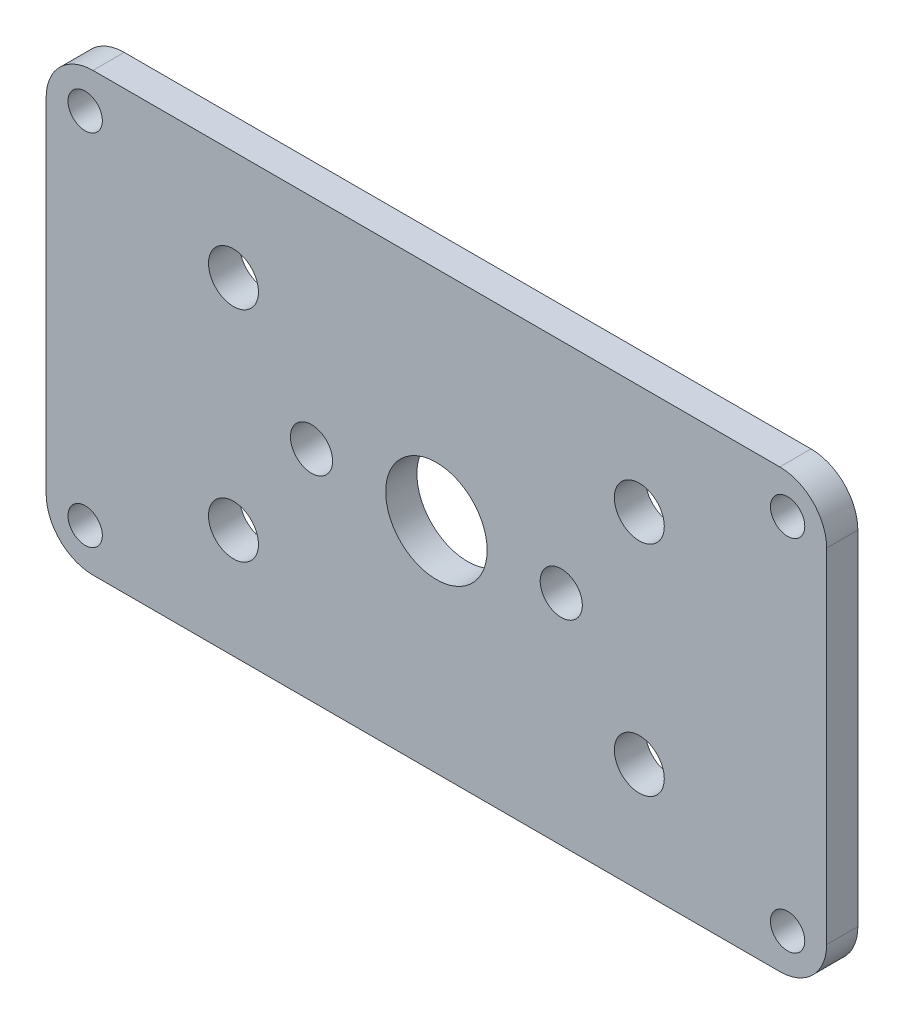
ISO-10303-21;
HEADER;
FILE_DESCRIPTION(('STEP AP214'),'2;1');
FILE_NAME('part.step','',(''),(''),'','','');
FILE_SCHEMA(('AUTOMOTIVE_DESIGN { 1 0 10303 214 1 1 1 1 }'));
ENDSEC;
DATA;
#1=APPLICATION_CONTEXT('core data for automotive mechanical design processes');
#2=APPLICATION_PROTOCOL_DEFINITION('international standard','automotive_design',2000,#1);
#3=PRODUCT_CONTEXT('',#1,'mechanical');
#4=PRODUCT('Part','Part','',(#3));
#5=PRODUCT_RELATED_PRODUCT_CATEGORY('part','',(#4));
#6=PRODUCT_DEFINITION_FORMATION('','',#4);
#7=PRODUCT_DEFINITION_CONTEXT('part definition',#1,'design');
#8=PRODUCT_DEFINITION('design','',#6,#7);
#9=PRODUCT_DEFINITION_SHAPE('','',#8);
#10=(LENGTH_UNIT() NAMED_UNIT(*) SI_UNIT(.MILLI.,.METRE.));
#11=(NAMED_UNIT(*) PLANE_ANGLE_UNIT() SI_UNIT($,.RADIAN.));
#12=(NAMED_UNIT(*) SI_UNIT($,.STERADIAN.) SOLID_ANGLE_UNIT());
#13=UNCERTAINTY_MEASURE_WITH_UNIT(LENGTH_MEASURE(1.E-05),#10,'distance_accuracy_value','');
#14=(GEOMETRIC_REPRESENTATION_CONTEXT(3) GLOBAL_UNCERTAINTY_ASSIGNED_CONTEXT((#13)) GLOBAL_UNIT_ASSIGNED_CONTEXT((#10,
#11,#12)) REPRESENTATION_CONTEXT('',''));
#15=CARTESIAN_POINT('',(0.,0.,0.));
#16=DIRECTION('',(0.,0.,1.));
#17=DIRECTION('',(1.,0.,0.));
#18=AXIS2_PLACEMENT_3D('',#15,#16,#17);
#19=CARTESIAN_POINT('',(-25.,-14.,-2.));
#20=DIRECTION('',(0.,1.,0.));
#21=DIRECTION('',(0.,0.,-1.));
#22=AXIS2_PLACEMENT_3D('',#19,#20,#21);
#23=PLANE('',#22);
#24=DIRECTION('',(1.,0.,0.));
#25=VECTOR('',#24,1.);
#26=CARTESIAN_POINT('',(-25.,-14.,-2.));
#27=LINE('',#26,#25);
#28=CARTESIAN_POINT('',(-22.,-14.,-2.));
#29=VERTEX_POINT('',#28);
#30=CARTESIAN_POINT('',(22.,-14.,-2.));
#31=VERTEX_POINT('',#30);
#32=EDGE_CURVE('E146',#29,#31,#27,.T.);
#33=ORIENTED_EDGE('',*,*,#32,.T.);
#34=DIRECTION('',(0.,0.,1.));
#35=VECTOR('',#34,1.);
#36=CARTESIAN_POINT('',(22.,-14.,-2.));
#37=LINE('',#36,#35);
#38=CARTESIAN_POINT('',(22.,-14.,0.));
#39=VERTEX_POINT('',#38);
#40=EDGE_CURVE('E127',#39,#31,#37,.F.);
#41=ORIENTED_EDGE('',*,*,#40,.F.);
#42=DIRECTION('',(1.,0.,0.));
#43=VECTOR('',#42,1.);
#44=CARTESIAN_POINT('',(-25.,-14.,0.));
#45=LINE('',#44,#43);
#46=CARTESIAN_POINT('',(-22.,-14.,0.));
#47=VERTEX_POINT('',#46);
#48=EDGE_CURVE('E109',#47,#39,#45,.T.);
#49=ORIENTED_EDGE('',*,*,#48,.F.);
#50=DIRECTION('',(0.,0.,1.));
#51=VECTOR('',#50,1.);
#52=CARTESIAN_POINT('',(-22.,-14.,0.));
#53=LINE('',#52,#51);
#54=EDGE_CURVE('E120',#29,#47,#53,.T.);
#55=ORIENTED_EDGE('',*,*,#54,.F.);
#56=EDGE_LOOP('',(#33,#41,#49,#55));
#57=FACE_BOUND('',#56,.T.);
#58=ADVANCED_FACE('F37',(#57),#23,.F.);
#59=CARTESIAN_POINT('',(25.,-14.,-2.));
#60=DIRECTION('',(-1.,0.,0.));
#61=DIRECTION('',(0.,0.,-1.));
#62=AXIS2_PLACEMENT_3D('',#59,#60,#61);
#63=PLANE('',#62);
#64=DIRECTION('',(0.,1.,0.));
#65=VECTOR('',#64,1.);
#66=CARTESIAN_POINT('',(25.,-14.,-2.));
#67=LINE('',#66,#65);
#68=CARTESIAN_POINT('',(25.,-11.,-2.));
#69=VERTEX_POINT('',#68);
#70=CARTESIAN_POINT('',(25.,11.,-2.));
#71=VERTEX_POINT('',#70);
#72=EDGE_CURVE('E227',#69,#71,#67,.T.);
#73=ORIENTED_EDGE('',*,*,#72,.T.);
#74=DIRECTION('',(0.,0.,1.));
#75=VECTOR('',#74,1.);
#76=CARTESIAN_POINT('',(25.,11.,-2.));
#77=LINE('',#76,#75);
#78=CARTESIAN_POINT('',(25.,11.,0.));
#79=VERTEX_POINT('',#78);
#80=EDGE_CURVE('E46',#79,#71,#77,.F.);
#81=ORIENTED_EDGE('',*,*,#80,.F.);
#82=DIRECTION('',(0.,1.,0.));
#83=VECTOR('',#82,1.);
#84=CARTESIAN_POINT('',(25.,-14.,0.));
#85=LINE('',#84,#83);
#86=CARTESIAN_POINT('',(25.,-11.,0.));
#87=VERTEX_POINT('',#86);
#88=EDGE_CURVE('E130',#87,#79,#85,.T.);
#89=ORIENTED_EDGE('',*,*,#88,.F.);
#90=DIRECTION('',(0.,0.,1.));
#91=VECTOR('',#90,1.);
#92=CARTESIAN_POINT('',(25.,-11.,-2.));
#93=LINE('',#92,#91);
#94=EDGE_CURVE('E11',#69,#87,#93,.T.);
#95=ORIENTED_EDGE('',*,*,#94,.F.);
#96=EDGE_LOOP('',(#73,#81,#89,#95));
#97=FACE_BOUND('',#96,.T.);
#98=ADVANCED_FACE('F247',(#97),#63,.F.);
#99=CARTESIAN_POINT('',(-25.,14.,-2.));
#100=DIRECTION('',(0.,1.,0.));
#101=DIRECTION('',(0.,0.,-1.));
#102=AXIS2_PLACEMENT_3D('',#99,#100,#101);
#103=PLANE('',#102);
#104=DIRECTION('',(1.,0.,0.));
#105=VECTOR('',#104,1.);
#106=CARTESIAN_POINT('',(-25.,14.,0.));
#107=LINE('',#106,#105);
#108=CARTESIAN_POINT('',(-22.,14.,0.));
#109=VERTEX_POINT('',#108);
#110=CARTESIAN_POINT('',(22.,14.,0.));
#111=VERTEX_POINT('',#110);
#112=EDGE_CURVE('E134',#109,#111,#107,.T.);
#113=ORIENTED_EDGE('',*,*,#112,.T.);
#114=DIRECTION('',(0.,0.,1.));
#115=VECTOR('',#114,1.);
#116=CARTESIAN_POINT('',(22.,14.,0.));
#117=LINE('',#116,#115);
#118=CARTESIAN_POINT('',(22.,14.,-2.));
#119=VERTEX_POINT('',#118);
#120=EDGE_CURVE('E161',#119,#111,#117,.T.);
#121=ORIENTED_EDGE('',*,*,#120,.F.);
#122=DIRECTION('',(1.,0.,0.));
#123=VECTOR('',#122,1.);
#124=CARTESIAN_POINT('',(-25.,14.,-2.));
#125=LINE('',#124,#123);
#126=CARTESIAN_POINT('',(-22.,14.,-2.));
#127=VERTEX_POINT('',#126);
#128=EDGE_CURVE('E229',#127,#119,#125,.T.);
#129=ORIENTED_EDGE('',*,*,#128,.F.);
#130=DIRECTION('',(0.,0.,1.));
#131=VECTOR('',#130,1.);
#132=CARTESIAN_POINT('',(-22.,14.,-2.));
#133=LINE('',#132,#131);
#134=EDGE_CURVE('E163',#109,#127,#133,.F.);
#135=ORIENTED_EDGE('',*,*,#134,.F.);
#136=EDGE_LOOP('',(#113,#121,#129,#135));
#137=FACE_BOUND('',#136,.T.);
#138=ADVANCED_FACE('F242',(#137),#103,.T.);
#139=CARTESIAN_POINT('',(-25.,-14.,-2.));
#140=DIRECTION('',(-1.,0.,0.));
#141=DIRECTION('',(0.,0.,-1.));
#142=AXIS2_PLACEMENT_3D('',#139,#140,#141);
#143=PLANE('',#142);
#144=DIRECTION('',(0.,1.,0.));
#145=VECTOR('',#144,1.);
#146=CARTESIAN_POINT('',(-25.,-14.,0.));
#147=LINE('',#146,#145);
#148=CARTESIAN_POINT('',(-25.,-11.,0.));
#149=VERTEX_POINT('',#148);
#150=CARTESIAN_POINT('',(-25.,11.,0.));
#151=VERTEX_POINT('',#150);
#152=EDGE_CURVE('E112',#149,#151,#147,.T.);
#153=ORIENTED_EDGE('',*,*,#152,.T.);
#154=DIRECTION('',(0.,0.,1.));
#155=VECTOR('',#154,1.);
#156=CARTESIAN_POINT('',(-25.,11.,-2.));
#157=LINE('',#156,#155);
#158=CARTESIAN_POINT('',(-25.,11.,-2.));
#159=VERTEX_POINT('',#158);
#160=EDGE_CURVE('E116',#159,#151,#157,.T.);
#161=ORIENTED_EDGE('',*,*,#160,.F.);
#162=DIRECTION('',(0.,1.,0.));
#163=VECTOR('',#162,1.);
#164=CARTESIAN_POINT('',(-25.,-14.,-2.));
#165=LINE('',#164,#163);
#166=CARTESIAN_POINT('',(-25.,-11.,-2.));
#167=VERTEX_POINT('',#166);
#168=EDGE_CURVE('E140',#167,#159,#165,.T.);
#169=ORIENTED_EDGE('',*,*,#168,.F.);
#170=DIRECTION('',(0.,0.,1.));
#171=VECTOR('',#170,1.);
#172=CARTESIAN_POINT('',(-25.,-11.,-2.));
#173=LINE('',#172,#171);
#174=EDGE_CURVE('E154',#149,#167,#173,.F.);
#175=ORIENTED_EDGE('',*,*,#174,.F.);
#176=EDGE_LOOP('',(#153,#161,#169,#175));
#177=FACE_BOUND('',#176,.T.);
#178=ADVANCED_FACE('F236',(#177),#143,.T.);
#179=CARTESIAN_POINT('',(0.,0.,-2.));
#180=DIRECTION('',(0.,0.,-1.));
#181=DIRECTION('',(1.,0.,0.));
#182=AXIS2_PLACEMENT_3D('',#179,#180,#181);
#183=PLANE('',#182);
#184=CARTESIAN_POINT('',(-13.,-7.,-2.));
#185=DIRECTION('',(0.,0.,1.));
#186=DIRECTION('',(-1.,0.,0.));
#187=AXIS2_PLACEMENT_3D('',#184,#185,#186);
#188=CIRCLE('',#187,1.6);
#189=CARTESIAN_POINT('',(-14.6,-7.,-2.));
#190=VERTEX_POINT('',#189);
#191=EDGE_CURVE('E194',#190,#190,#188,.T.);
#192=ORIENTED_EDGE('',*,*,#191,.T.);
#193=EDGE_LOOP('',(#192));
#194=FACE_BOUND('',#193,.T.);
#195=CARTESIAN_POINT('',(13.,7.,-2.));
#196=DIRECTION('',(0.,0.,1.));
#197=DIRECTION('',(1.,0.,0.));
#198=AXIS2_PLACEMENT_3D('',#195,#196,#197);
#199=CIRCLE('',#198,1.6);
#200=CARTESIAN_POINT('',(14.6,7.,-2.));
#201=VERTEX_POINT('',#200);
#202=EDGE_CURVE('E432',#201,#201,#199,.T.);
#203=ORIENTED_EDGE('',*,*,#202,.T.);
#204=EDGE_LOOP('',(#203));
#205=FACE_BOUND('',#204,.T.);
#206=CARTESIAN_POINT('',(13.,-7.,-2.));
#207=DIRECTION('',(0.,0.,1.));
#208=DIRECTION('',(-1.,0.,0.));
#209=AXIS2_PLACEMENT_3D('',#206,#207,#208);
#210=CIRCLE('',#209,1.6);
#211=CARTESIAN_POINT('',(11.4,-7.,-2.));
#212=VERTEX_POINT('',#211);
#213=EDGE_CURVE('E207',#212,#212,#210,.T.);
#214=ORIENTED_EDGE('',*,*,#213,.T.);
#215=EDGE_LOOP('',(#214));
#216=FACE_BOUND('',#215,.T.);
#217=CARTESIAN_POINT('',(-13.,7.,-2.));
#218=DIRECTION('',(0.,0.,1.));
#219=DIRECTION('',(1.,0.,0.));
#220=AXIS2_PLACEMENT_3D('',#217,#218,#219);
#221=CIRCLE('',#220,1.6);
#222=CARTESIAN_POINT('',(-11.4,7.,-2.));
#223=VERTEX_POINT('',#222);
#224=EDGE_CURVE('E190',#223,#223,#221,.T.);
#225=ORIENTED_EDGE('',*,*,#224,.T.);
#226=EDGE_LOOP('',(#225));
#227=FACE_BOUND('',#226,.T.);
#228=CARTESIAN_POINT('',(0.,0.,-2.));
#229=DIRECTION('',(0.,0.,1.));
#230=DIRECTION('',(1.,0.,0.));
#231=AXIS2_PLACEMENT_3D('',#228,#229,#230);
#232=CIRCLE('',#231,3.25);
#233=CARTESIAN_POINT('',(3.25,0.,-2.));
#234=VERTEX_POINT('',#233);
#235=EDGE_CURVE('E186',#234,#234,#232,.T.);
#236=ORIENTED_EDGE('',*,*,#235,.T.);
#237=EDGE_LOOP('',(#236));
#238=FACE_BOUND('',#237,.T.);
#239=CARTESIAN_POINT('',(-22.5,-11.5,-2.));
#240=DIRECTION('',(0.,0.,1.));
#241=DIRECTION('',(1.,0.,0.));
#242=AXIS2_PLACEMENT_3D('',#239,#240,#241);
#243=CIRCLE('',#242,1.1);
#244=CARTESIAN_POINT('',(-21.4,-11.5,-2.));
#245=VERTEX_POINT('',#244);
#246=EDGE_CURVE('E170',#245,#245,#243,.T.);
#247=ORIENTED_EDGE('',*,*,#246,.T.);
#248=EDGE_LOOP('',(#247));
#249=FACE_BOUND('',#248,.T.);
#250=CARTESIAN_POINT('',(22.5000000000001,-11.5,-2.));
#251=DIRECTION('',(0.,0.,1.));
#252=DIRECTION('',(1.,0.,0.));
#253=AXIS2_PLACEMENT_3D('',#250,#251,#252);
#254=CIRCLE('',#253,1.1);
#255=CARTESIAN_POINT('',(23.6000000000001,-11.5,-2.));
#256=VERTEX_POINT('',#255);
#257=EDGE_CURVE('E213',#256,#256,#254,.T.);
#258=ORIENTED_EDGE('',*,*,#257,.T.);
#259=EDGE_LOOP('',(#258));
#260=FACE_BOUND('',#259,.T.);
#261=CARTESIAN_POINT('',(22.5,11.5,-2.));
#262=DIRECTION('',(0.,0.,1.));
#263=DIRECTION('',(1.,0.,0.));
#264=AXIS2_PLACEMENT_3D('',#261,#262,#263);
#265=CIRCLE('',#264,1.1);
#266=CARTESIAN_POINT('',(23.6,11.5,-2.));
#267=VERTEX_POINT('',#266);
#268=EDGE_CURVE('E216',#267,#267,#265,.T.);
#269=ORIENTED_EDGE('',*,*,#268,.T.);
#270=EDGE_LOOP('',(#269));
#271=FACE_BOUND('',#270,.T.);
#272=CARTESIAN_POINT('',(-8.00000000000001,0.,-2.));
#273=DIRECTION('',(0.,0.,1.));
#274=DIRECTION('',(1.,0.,0.));
#275=AXIS2_PLACEMENT_3D('',#272,#273,#274);
#276=CIRCLE('',#275,1.35);
#277=CARTESIAN_POINT('',(-6.65000000000001,0.,-2.));
#278=VERTEX_POINT('',#277);
#279=EDGE_CURVE('E219',#278,#278,#276,.T.);
#280=ORIENTED_EDGE('',*,*,#279,.T.);
#281=EDGE_LOOP('',(#280));
#282=FACE_BOUND('',#281,.T.);
#283=CARTESIAN_POINT('',(8.,0.,-2.));
#284=DIRECTION('',(0.,0.,1.));
#285=DIRECTION('',(1.,0.,0.));
#286=AXIS2_PLACEMENT_3D('',#283,#284,#285);
#287=CIRCLE('',#286,1.35);
#288=CARTESIAN_POINT('',(9.35,0.,-2.));
#289=VERTEX_POINT('',#288);
#290=EDGE_CURVE('E185',#289,#289,#287,.T.);
#291=ORIENTED_EDGE('',*,*,#290,.T.);
#292=EDGE_LOOP('',(#291));
#293=FACE_BOUND('',#292,.T.);
#294=CARTESIAN_POINT('',(-22.5,11.5,-2.));
#295=DIRECTION('',(0.,0.,1.));
#296=DIRECTION('',(1.,0.,0.));
#297=AXIS2_PLACEMENT_3D('',#294,#295,#296);
#298=CIRCLE('',#297,1.1);
#299=CARTESIAN_POINT('',(-21.4,11.5,-2.));
#300=VERTEX_POINT('',#299);
#301=EDGE_CURVE('E137',#300,#300,#298,.T.);
#302=ORIENTED_EDGE('',*,*,#301,.T.);
#303=EDGE_LOOP('',(#302));
#304=FACE_BOUND('',#303,.T.);
#305=ORIENTED_EDGE('',*,*,#168,.T.);
#306=CARTESIAN_POINT('',(-22.,11.,-2.));
#307=DIRECTION('',(0.,0.,1.));
#308=DIRECTION('',(1.,0.,0.));
#309=AXIS2_PLACEMENT_3D('',#306,#307,#308);
#310=CIRCLE('',#309,3.);
#311=EDGE_CURVE('E61',#127,#159,#310,.T.);
#312=ORIENTED_EDGE('',*,*,#311,.F.);
#313=ORIENTED_EDGE('',*,*,#128,.T.);
#314=CARTESIAN_POINT('',(22.,11.,-2.));
#315=DIRECTION('',(0.,0.,1.));
#316=DIRECTION('',(1.,0.,0.));
#317=AXIS2_PLACEMENT_3D('',#314,#315,#316);
#318=CIRCLE('',#317,3.);
#319=EDGE_CURVE('E54',#71,#119,#318,.T.);
#320=ORIENTED_EDGE('',*,*,#319,.F.);
#321=ORIENTED_EDGE('',*,*,#72,.F.);
#322=CARTESIAN_POINT('',(22.,-11.,-2.));
#323=DIRECTION('',(0.,0.,1.));
#324=DIRECTION('',(1.,0.,0.));
#325=AXIS2_PLACEMENT_3D('',#322,#323,#324);
#326=CIRCLE('',#325,3.);
#327=EDGE_CURVE('E157',#31,#69,#326,.T.);
#328=ORIENTED_EDGE('',*,*,#327,.F.);
#329=ORIENTED_EDGE('',*,*,#32,.F.);
#330=CARTESIAN_POINT('',(-22.,-11.,-2.));
#331=DIRECTION('',(0.,0.,1.));
#332=DIRECTION('',(1.,0.,0.));
#333=AXIS2_PLACEMENT_3D('',#330,#331,#332);
#334=CIRCLE('',#333,3.);
#335=EDGE_CURVE('E122',#167,#29,#334,.T.);
#336=ORIENTED_EDGE('',*,*,#335,.F.);
#337=EDGE_LOOP('',(#305,#312,#313,#320,#321,#328,#329,#336));
#338=FACE_BOUND('',#337,.T.);
#339=ADVANCED_FACE('F234',(#194,#205,#216,#227,#238,#249,#260,#271,#282,#293,#304,#338),#183,.T.);
#340=CARTESIAN_POINT('',(0.,0.,0.));
#341=DIRECTION('',(0.,0.,-1.));
#342=DIRECTION('',(1.,0.,0.));
#343=AXIS2_PLACEMENT_3D('',#340,#341,#342);
#344=PLANE('',#343);
#345=CARTESIAN_POINT('',(-13.,-7.,0.));
#346=DIRECTION('',(0.,0.,1.));
#347=DIRECTION('',(1.,0.,0.));
#348=AXIS2_PLACEMENT_3D('',#345,#346,#347);
#349=CIRCLE('',#348,1.6);
#350=CARTESIAN_POINT('',(-11.4,-7.,0.));
#351=VERTEX_POINT('',#350);
#352=EDGE_CURVE('E41',#351,#351,#349,.T.);
#353=ORIENTED_EDGE('',*,*,#352,.F.);
#354=EDGE_LOOP('',(#353));
#355=FACE_BOUND('',#354,.T.);
#356=CARTESIAN_POINT('',(13.,7.,0.));
#357=DIRECTION('',(0.,0.,1.));
#358=DIRECTION('',(1.,0.,0.));
#359=AXIS2_PLACEMENT_3D('',#356,#357,#358);
#360=CIRCLE('',#359,1.6);
#361=CARTESIAN_POINT('',(14.6,7.,0.));
#362=VERTEX_POINT('',#361);
#363=EDGE_CURVE('E193',#362,#362,#360,.T.);
#364=ORIENTED_EDGE('',*,*,#363,.F.);
#365=EDGE_LOOP('',(#364));
#366=FACE_BOUND('',#365,.T.);
#367=CARTESIAN_POINT('',(13.,-7.,0.));
#368=DIRECTION('',(0.,0.,1.));
#369=DIRECTION('',(1.,0.,0.));
#370=AXIS2_PLACEMENT_3D('',#367,#368,#369);
#371=CIRCLE('',#370,1.6);
#372=CARTESIAN_POINT('',(14.6,-7.,0.));
#373=VERTEX_POINT('',#372);
#374=EDGE_CURVE('E191',#373,#373,#371,.T.);
#375=ORIENTED_EDGE('',*,*,#374,.F.);
#376=EDGE_LOOP('',(#375));
#377=FACE_BOUND('',#376,.T.);
#378=CARTESIAN_POINT('',(-13.,7.,0.));
#379=DIRECTION('',(0.,0.,1.));
#380=DIRECTION('',(1.,0.,0.));
#381=AXIS2_PLACEMENT_3D('',#378,#379,#380);
#382=CIRCLE('',#381,1.6);
#383=CARTESIAN_POINT('',(-11.4,7.,0.));
#384=VERTEX_POINT('',#383);
#385=EDGE_CURVE('E187',#384,#384,#382,.T.);
#386=ORIENTED_EDGE('',*,*,#385,.F.);
#387=EDGE_LOOP('',(#386));
#388=FACE_BOUND('',#387,.T.);
#389=CARTESIAN_POINT('',(0.,0.,0.));
#390=DIRECTION('',(0.,0.,1.));
#391=DIRECTION('',(1.,0.,0.));
#392=AXIS2_PLACEMENT_3D('',#389,#390,#391);
#393=CIRCLE('',#392,3.25);
#394=CARTESIAN_POINT('',(3.25,0.,0.));
#395=VERTEX_POINT('',#394);
#396=EDGE_CURVE('E182',#395,#395,#393,.T.);
#397=ORIENTED_EDGE('',*,*,#396,.F.);
#398=EDGE_LOOP('',(#397));
#399=FACE_BOUND('',#398,.T.);
#400=CARTESIAN_POINT('',(-22.5,-11.5,0.));
#401=DIRECTION('',(0.,0.,1.));
#402=DIRECTION('',(1.,0.,0.));
#403=AXIS2_PLACEMENT_3D('',#400,#401,#402);
#404=CIRCLE('',#403,1.1);
#405=CARTESIAN_POINT('',(-21.4,-11.5,0.));
#406=VERTEX_POINT('',#405);
#407=EDGE_CURVE('E179',#406,#406,#404,.T.);
#408=ORIENTED_EDGE('',*,*,#407,.F.);
#409=EDGE_LOOP('',(#408));
#410=FACE_BOUND('',#409,.T.);
#411=CARTESIAN_POINT('',(22.5000000000001,-11.5,0.));
#412=DIRECTION('',(0.,0.,1.));
#413=DIRECTION('',(1.,0.,0.));
#414=AXIS2_PLACEMENT_3D('',#411,#412,#413);
#415=CIRCLE('',#414,1.1);
#416=CARTESIAN_POINT('',(23.6000000000001,-11.5,0.));
#417=VERTEX_POINT('',#416);
#418=EDGE_CURVE('E176',#417,#417,#415,.T.);
#419=ORIENTED_EDGE('',*,*,#418,.F.);
#420=EDGE_LOOP('',(#419));
#421=FACE_BOUND('',#420,.T.);
#422=CARTESIAN_POINT('',(22.5,11.5,0.));
#423=DIRECTION('',(0.,0.,1.));
#424=DIRECTION('',(1.,0.,0.));
#425=AXIS2_PLACEMENT_3D('',#422,#423,#424);
#426=CIRCLE('',#425,1.1);
#427=CARTESIAN_POINT('',(23.6,11.5,0.));
#428=VERTEX_POINT('',#427);
#429=EDGE_CURVE('E173',#428,#428,#426,.T.);
#430=ORIENTED_EDGE('',*,*,#429,.F.);
#431=EDGE_LOOP('',(#430));
#432=FACE_BOUND('',#431,.T.);
#433=CARTESIAN_POINT('',(-8.00000000000001,0.,0.));
#434=DIRECTION('',(0.,0.,1.));
#435=DIRECTION('',(1.,0.,0.));
#436=AXIS2_PLACEMENT_3D('',#433,#434,#435);
#437=CIRCLE('',#436,1.35);
#438=CARTESIAN_POINT('',(-6.65000000000001,0.,0.));
#439=VERTEX_POINT('',#438);
#440=EDGE_CURVE('E169',#439,#439,#437,.T.);
#441=ORIENTED_EDGE('',*,*,#440,.F.);
#442=EDGE_LOOP('',(#441));
#443=FACE_BOUND('',#442,.T.);
#444=CARTESIAN_POINT('',(8.,0.,0.));
#445=DIRECTION('',(0.,0.,1.));
#446=DIRECTION('',(1.,0.,0.));
#447=AXIS2_PLACEMENT_3D('',#444,#445,#446);
#448=CIRCLE('',#447,1.35);
#449=CARTESIAN_POINT('',(9.35,0.,0.));
#450=VERTEX_POINT('',#449);
#451=EDGE_CURVE('E166',#450,#450,#448,.T.);
#452=ORIENTED_EDGE('',*,*,#451,.F.);
#453=EDGE_LOOP('',(#452));
#454=FACE_BOUND('',#453,.T.);
#455=CARTESIAN_POINT('',(-22.5,11.5,0.));
#456=DIRECTION('',(0.,0.,1.));
#457=DIRECTION('',(1.,0.,0.));
#458=AXIS2_PLACEMENT_3D('',#455,#456,#457);
#459=CIRCLE('',#458,1.1);
#460=CARTESIAN_POINT('',(-21.4,11.5,0.));
#461=VERTEX_POINT('',#460);
#462=EDGE_CURVE('E131',#461,#461,#459,.T.);
#463=ORIENTED_EDGE('',*,*,#462,.F.);
#464=EDGE_LOOP('',(#463));
#465=FACE_BOUND('',#464,.T.);
#466=ORIENTED_EDGE('',*,*,#48,.T.);
#467=CARTESIAN_POINT('',(22.,-11.,0.));
#468=DIRECTION('',(0.,0.,1.));
#469=DIRECTION('',(1.,0.,0.));
#470=AXIS2_PLACEMENT_3D('',#467,#468,#469);
#471=CIRCLE('',#470,3.);
#472=EDGE_CURVE('E149',#87,#39,#471,.F.);
#473=ORIENTED_EDGE('',*,*,#472,.F.);
#474=ORIENTED_EDGE('',*,*,#88,.T.);
#475=CARTESIAN_POINT('',(22.,11.,0.));
#476=DIRECTION('',(0.,0.,1.));
#477=DIRECTION('',(1.,0.,0.));
#478=AXIS2_PLACEMENT_3D('',#475,#476,#477);
#479=CIRCLE('',#478,3.);
#480=EDGE_CURVE('E126',#111,#79,#479,.F.);
#481=ORIENTED_EDGE('',*,*,#480,.F.);
#482=ORIENTED_EDGE('',*,*,#112,.F.);
#483=CARTESIAN_POINT('',(-22.,11.,0.));
#484=DIRECTION('',(0.,0.,1.));
#485=DIRECTION('',(1.,0.,0.));
#486=AXIS2_PLACEMENT_3D('',#483,#484,#485);
#487=CIRCLE('',#486,3.);
#488=EDGE_CURVE('E117',#151,#109,#487,.F.);
#489=ORIENTED_EDGE('',*,*,#488,.F.);
#490=ORIENTED_EDGE('',*,*,#152,.F.);
#491=CARTESIAN_POINT('',(-22.,-11.,0.));
#492=DIRECTION('',(0.,0.,1.));
#493=DIRECTION('',(1.,0.,0.));
#494=AXIS2_PLACEMENT_3D('',#491,#492,#493);
#495=CIRCLE('',#494,3.);
#496=EDGE_CURVE('E105',#47,#149,#495,.F.);
#497=ORIENTED_EDGE('',*,*,#496,.F.);
#498=EDGE_LOOP('',(#466,#473,#474,#481,#482,#489,#490,#497));
#499=FACE_BOUND('',#498,.T.);
#500=ADVANCED_FACE('F107',(#355,#366,#377,#388,#399,#410,#421,#432,#443,#454,#465,#499),#344,.F.);
#501=CARTESIAN_POINT('',(-22.,-11.,-2.));
#502=DIRECTION('',(0.,0.,-1.));
#503=DIRECTION('',(1.,0.,0.));
#504=AXIS2_PLACEMENT_3D('',#501,#502,#503);
#505=CYLINDRICAL_SURFACE('',#504,3.);
#506=ORIENTED_EDGE('',*,*,#335,.T.);
#507=ORIENTED_EDGE('',*,*,#54,.T.);
#508=ORIENTED_EDGE('',*,*,#496,.T.);
#509=ORIENTED_EDGE('',*,*,#174,.T.);
#510=EDGE_LOOP('',(#506,#507,#508,#509));
#511=FACE_BOUND('',#510,.T.);
#512=ADVANCED_FACE('F121',(#511),#505,.T.);
#513=CARTESIAN_POINT('',(-22.,11.,-2.));
#514=DIRECTION('',(0.,0.,1.));
#515=DIRECTION('',(-1.,0.,0.));
#516=AXIS2_PLACEMENT_3D('',#513,#514,#515);
#517=CYLINDRICAL_SURFACE('',#516,3.);
#518=ORIENTED_EDGE('',*,*,#311,.T.);
#519=ORIENTED_EDGE('',*,*,#160,.T.);
#520=ORIENTED_EDGE('',*,*,#488,.T.);
#521=ORIENTED_EDGE('',*,*,#134,.T.);
#522=EDGE_LOOP('',(#518,#519,#520,#521));
#523=FACE_BOUND('',#522,.T.);
#524=ADVANCED_FACE('F238',(#523),#517,.T.);
#525=CARTESIAN_POINT('',(22.,-11.,-2.));
#526=DIRECTION('',(0.,0.,1.));
#527=DIRECTION('',(-1.,0.,0.));
#528=AXIS2_PLACEMENT_3D('',#525,#526,#527);
#529=CYLINDRICAL_SURFACE('',#528,3.);
#530=ORIENTED_EDGE('',*,*,#327,.T.);
#531=ORIENTED_EDGE('',*,*,#94,.T.);
#532=ORIENTED_EDGE('',*,*,#472,.T.);
#533=ORIENTED_EDGE('',*,*,#40,.T.);
#534=EDGE_LOOP('',(#530,#531,#532,#533));
#535=FACE_BOUND('',#534,.T.);
#536=ADVANCED_FACE('F250',(#535),#529,.T.);
#537=CARTESIAN_POINT('',(22.,11.,-2.));
#538=DIRECTION('',(0.,0.,-1.));
#539=DIRECTION('',(1.,0.,0.));
#540=AXIS2_PLACEMENT_3D('',#537,#538,#539);
#541=CYLINDRICAL_SURFACE('',#540,3.);
#542=ORIENTED_EDGE('',*,*,#319,.T.);
#543=ORIENTED_EDGE('',*,*,#120,.T.);
#544=ORIENTED_EDGE('',*,*,#480,.T.);
#545=ORIENTED_EDGE('',*,*,#80,.T.);
#546=EDGE_LOOP('',(#542,#543,#544,#545));
#547=FACE_BOUND('',#546,.T.);
#548=ADVANCED_FACE('F39',(#547),#541,.T.);
#549=CARTESIAN_POINT('',(-22.5,11.5,8.));
#550=DIRECTION('',(0.,0.,-1.));
#551=DIRECTION('',(1.,0.,0.));
#552=AXIS2_PLACEMENT_3D('',#549,#550,#551);
#553=CYLINDRICAL_SURFACE('',#552,1.1);
#554=ORIENTED_EDGE('',*,*,#301,.F.);
#555=EDGE_LOOP('',(#554));
#556=FACE_BOUND('',#555,.T.);
#557=ORIENTED_EDGE('',*,*,#462,.T.);
#558=EDGE_LOOP('',(#557));
#559=FACE_BOUND('',#558,.T.);
#560=ADVANCED_FACE('F256',(#556,#559),#553,.F.);
#561=CARTESIAN_POINT('',(8.,0.,8.));
#562=DIRECTION('',(0.,0.,-1.));
#563=DIRECTION('',(1.,0.,0.));
#564=AXIS2_PLACEMENT_3D('',#561,#562,#563);
#565=CYLINDRICAL_SURFACE('',#564,1.35);
#566=ORIENTED_EDGE('',*,*,#290,.F.);
#567=EDGE_LOOP('',(#566));
#568=FACE_BOUND('',#567,.T.);
#569=ORIENTED_EDGE('',*,*,#451,.T.);
#570=EDGE_LOOP('',(#569));
#571=FACE_BOUND('',#570,.T.);
#572=ADVANCED_FACE('F327',(#568,#571),#565,.F.);
#573=CARTESIAN_POINT('',(-8.00000000000001,0.,8.));
#574=DIRECTION('',(0.,0.,-1.));
#575=DIRECTION('',(1.,0.,0.));
#576=AXIS2_PLACEMENT_3D('',#573,#574,#575);
#577=CYLINDRICAL_SURFACE('',#576,1.35);
#578=ORIENTED_EDGE('',*,*,#279,.F.);
#579=EDGE_LOOP('',(#578));
#580=FACE_BOUND('',#579,.T.);
#581=ORIENTED_EDGE('',*,*,#440,.T.);
#582=EDGE_LOOP('',(#581));
#583=FACE_BOUND('',#582,.T.);
#584=ADVANCED_FACE('F336',(#580,#583),#577,.F.);
#585=CARTESIAN_POINT('',(22.5,11.5,8.));
#586=DIRECTION('',(0.,0.,-1.));
#587=DIRECTION('',(1.,0.,0.));
#588=AXIS2_PLACEMENT_3D('',#585,#586,#587);
#589=CYLINDRICAL_SURFACE('',#588,1.1);
#590=ORIENTED_EDGE('',*,*,#268,.F.);
#591=EDGE_LOOP('',(#590));
#592=FACE_BOUND('',#591,.T.);
#593=ORIENTED_EDGE('',*,*,#429,.T.);
#594=EDGE_LOOP('',(#593));
#595=FACE_BOUND('',#594,.T.);
#596=ADVANCED_FACE('F346',(#592,#595),#589,.F.);
#597=CARTESIAN_POINT('',(22.5000000000001,-11.5,8.));
#598=DIRECTION('',(0.,0.,-1.));
#599=DIRECTION('',(1.,0.,0.));
#600=AXIS2_PLACEMENT_3D('',#597,#598,#599);
#601=CYLINDRICAL_SURFACE('',#600,1.1);
#602=ORIENTED_EDGE('',*,*,#257,.F.);
#603=EDGE_LOOP('',(#602));
#604=FACE_BOUND('',#603,.T.);
#605=ORIENTED_EDGE('',*,*,#418,.T.);
#606=EDGE_LOOP('',(#605));
#607=FACE_BOUND('',#606,.T.);
#608=ADVANCED_FACE('F356',(#604,#607),#601,.F.);
#609=CARTESIAN_POINT('',(-22.5,-11.5,8.));
#610=DIRECTION('',(0.,0.,-1.));
#611=DIRECTION('',(1.,0.,0.));
#612=AXIS2_PLACEMENT_3D('',#609,#610,#611);
#613=CYLINDRICAL_SURFACE('',#612,1.1);
#614=ORIENTED_EDGE('',*,*,#246,.F.);
#615=EDGE_LOOP('',(#614));
#616=FACE_BOUND('',#615,.T.);
#617=ORIENTED_EDGE('',*,*,#407,.T.);
#618=EDGE_LOOP('',(#617));
#619=FACE_BOUND('',#618,.T.);
#620=ADVANCED_FACE('F366',(#616,#619),#613,.F.);
#621=CARTESIAN_POINT('',(0.,0.,8.));
#622=DIRECTION('',(0.,0.,-1.));
#623=DIRECTION('',(1.,0.,0.));
#624=AXIS2_PLACEMENT_3D('',#621,#622,#623);
#625=CYLINDRICAL_SURFACE('',#624,3.25);
#626=ORIENTED_EDGE('',*,*,#235,.F.);
#627=EDGE_LOOP('',(#626));
#628=FACE_BOUND('',#627,.T.);
#629=ORIENTED_EDGE('',*,*,#396,.T.);
#630=EDGE_LOOP('',(#629));
#631=FACE_BOUND('',#630,.T.);
#632=ADVANCED_FACE('F376',(#628,#631),#625,.F.);
#633=CARTESIAN_POINT('',(-13.,7.,8.));
#634=DIRECTION('',(0.,0.,-1.));
#635=DIRECTION('',(1.,0.,0.));
#636=AXIS2_PLACEMENT_3D('',#633,#634,#635);
#637=CYLINDRICAL_SURFACE('',#636,1.6);
#638=ORIENTED_EDGE('',*,*,#224,.F.);
#639=EDGE_LOOP('',(#638));
#640=FACE_BOUND('',#639,.T.);
#641=ORIENTED_EDGE('',*,*,#385,.T.);
#642=EDGE_LOOP('',(#641));
#643=FACE_BOUND('',#642,.T.);
#644=ADVANCED_FACE('F386',(#640,#643),#637,.F.);
#645=CARTESIAN_POINT('',(13.,-7.,8.));
#646=DIRECTION('',(0.,0.,-1.));
#647=DIRECTION('',(1.,0.,0.));
#648=AXIS2_PLACEMENT_3D('',#645,#646,#647);
#649=CYLINDRICAL_SURFACE('',#648,1.6);
#650=ORIENTED_EDGE('',*,*,#213,.F.);
#651=EDGE_LOOP('',(#650));
#652=FACE_BOUND('',#651,.T.);
#653=ORIENTED_EDGE('',*,*,#374,.T.);
#654=EDGE_LOOP('',(#653));
#655=FACE_BOUND('',#654,.T.);
#656=ADVANCED_FACE('F396',(#652,#655),#649,.F.);
#657=CARTESIAN_POINT('',(13.,7.,8.));
#658=DIRECTION('',(0.,0.,-1.));
#659=DIRECTION('',(1.,0.,0.));
#660=AXIS2_PLACEMENT_3D('',#657,#658,#659);
#661=CYLINDRICAL_SURFACE('',#660,1.6);
#662=ORIENTED_EDGE('',*,*,#202,.F.);
#663=EDGE_LOOP('',(#662));
#664=FACE_BOUND('',#663,.T.);
#665=ORIENTED_EDGE('',*,*,#363,.T.);
#666=EDGE_LOOP('',(#665));
#667=FACE_BOUND('',#666,.T.);
#668=ADVANCED_FACE('F406',(#664,#667),#661,.F.);
#669=CARTESIAN_POINT('',(-13.,-7.,8.));
#670=DIRECTION('',(0.,0.,-1.));
#671=DIRECTION('',(1.,0.,0.));
#672=AXIS2_PLACEMENT_3D('',#669,#670,#671);
#673=CYLINDRICAL_SURFACE('',#672,1.6);
#674=ORIENTED_EDGE('',*,*,#191,.F.);
#675=EDGE_LOOP('',(#674));
#676=FACE_BOUND('',#675,.T.);
#677=ORIENTED_EDGE('',*,*,#352,.T.);
#678=EDGE_LOOP('',(#677));
#679=FACE_BOUND('',#678,.T.);
#680=ADVANCED_FACE('F416',(#676,#679),#673,.F.);
#681=CLOSED_SHELL('',(#58,#98,#138,#178,#339,#500,#512,#524,#536,#548,#560,#572,#584,#596,#608,
#620,#632,#644,#656,#668,#680));
#682=MANIFOLD_SOLID_BREP('B2',#681);
#683=ADVANCED_BREP_SHAPE_REPRESENTATION('',(#18,#682),#14);
#684=SHAPE_DEFINITION_REPRESENTATION(#9,#683);
ENDSEC;
END-ISO-10303-21;
